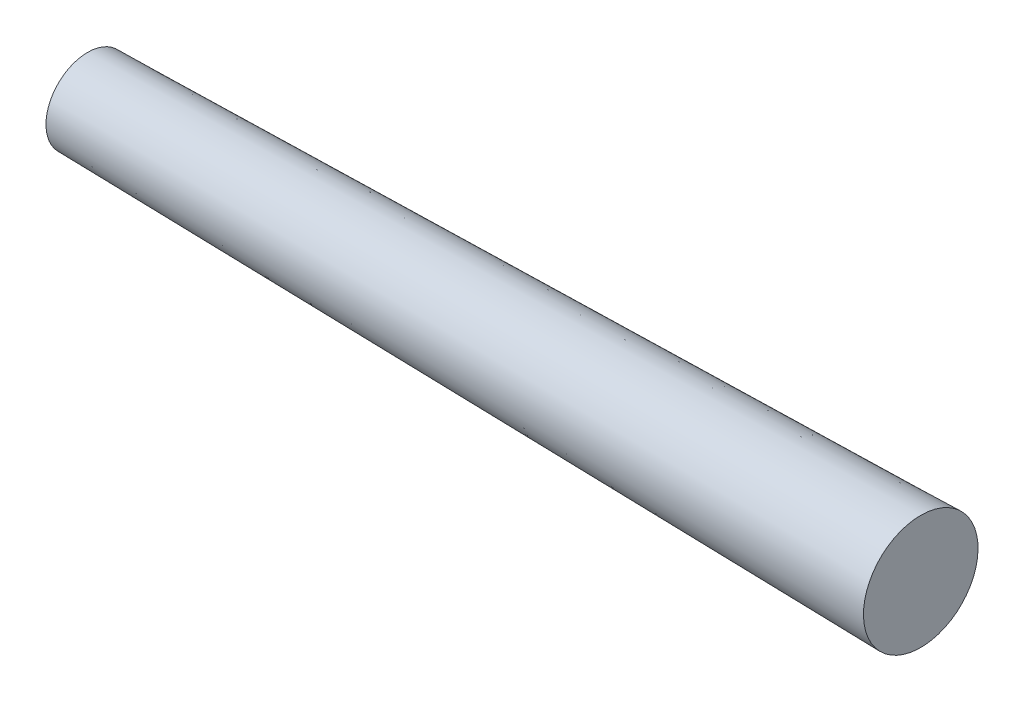
ISO-10303-21;
HEADER;
FILE_DESCRIPTION(('STEP AP214'),'2;1');
FILE_NAME('part.step','',(''),(''),'','','');
FILE_SCHEMA(('AUTOMOTIVE_DESIGN { 1 0 10303 214 1 1 1 1 }'));
ENDSEC;
DATA;
#1=APPLICATION_CONTEXT('core data for automotive mechanical design processes');
#2=APPLICATION_PROTOCOL_DEFINITION('international standard','automotive_design',2000,#1);
#3=PRODUCT_CONTEXT('',#1,'mechanical');
#4=PRODUCT('Part','Part','',(#3));
#5=PRODUCT_RELATED_PRODUCT_CATEGORY('part','',(#4));
#6=PRODUCT_DEFINITION_FORMATION('','',#4);
#7=PRODUCT_DEFINITION_CONTEXT('part definition',#1,'design');
#8=PRODUCT_DEFINITION('design','',#6,#7);
#9=PRODUCT_DEFINITION_SHAPE('','',#8);
#10=(LENGTH_UNIT() NAMED_UNIT(*) SI_UNIT(.MILLI.,.METRE.));
#11=(NAMED_UNIT(*) PLANE_ANGLE_UNIT() SI_UNIT($,.RADIAN.));
#12=(NAMED_UNIT(*) SI_UNIT($,.STERADIAN.) SOLID_ANGLE_UNIT());
#13=UNCERTAINTY_MEASURE_WITH_UNIT(LENGTH_MEASURE(1.E-05),#10,'distance_accuracy_value','');
#14=(GEOMETRIC_REPRESENTATION_CONTEXT(3) GLOBAL_UNCERTAINTY_ASSIGNED_CONTEXT((#13)) GLOBAL_UNIT_ASSIGNED_CONTEXT((#10,
#11,#12)) REPRESENTATION_CONTEXT('',''));
#15=CARTESIAN_POINT('',(0.,0.,0.));
#16=DIRECTION('',(0.,0.,1.));
#17=DIRECTION('',(1.,0.,0.));
#18=AXIS2_PLACEMENT_3D('',#15,#16,#17);
#19=CARTESIAN_POINT('',(-33.8804000981836,2.5,0.));
#20=DIRECTION('',(-1.,0.,0.));
#21=DIRECTION('',(0.,-1.,0.));
#22=AXIS2_PLACEMENT_3D('',#19,#20,#21);
#23=PLANE('',#22);
#24=CARTESIAN_POINT('',(-33.8804000981836,0.,0.));
#25=DIRECTION('',(1.,0.,0.));
#26=DIRECTION('',(0.,1.,0.));
#27=AXIS2_PLACEMENT_3D('',#24,#25,#26);
#28=CIRCLE('',#27,4.);
#29=CARTESIAN_POINT('',(-33.8804000981836,4.,0.));
#30=VERTEX_POINT('',#29);
#31=EDGE_CURVE('E10',#30,#30,#28,.T.);
#32=ORIENTED_EDGE('',*,*,#31,.F.);
#33=EDGE_LOOP('',(#32));
#34=FACE_BOUND('',#33,.T.);
#35=ADVANCED_FACE('F31',(#34),#23,.T.);
#36=CARTESIAN_POINT('',(46.1195999018164,0.,0.));
#37=DIRECTION('',(1.,0.,0.));
#38=DIRECTION('',(0.,1.,0.));
#39=AXIS2_PLACEMENT_3D('',#36,#37,#38);
#40=CONICAL_SURFACE('',#39,5.5,0.0187478031977444);
#41=ORIENTED_EDGE('',*,*,#31,.T.);
#42=EDGE_LOOP('',(#41));
#43=FACE_BOUND('',#42,.T.);
#44=CARTESIAN_POINT('',(46.1195999018164,0.,0.));
#45=DIRECTION('',(1.,0.,0.));
#46=DIRECTION('',(0.,1.,0.));
#47=AXIS2_PLACEMENT_3D('',#44,#45,#46);
#48=CIRCLE('',#47,5.5);
#49=CARTESIAN_POINT('',(46.1195999018164,5.50000000000001,0.));
#50=VERTEX_POINT('',#49);
#51=EDGE_CURVE('E37',#50,#50,#48,.T.);
#52=ORIENTED_EDGE('',*,*,#51,.F.);
#53=EDGE_LOOP('',(#52));
#54=FACE_BOUND('',#53,.T.);
#55=ADVANCED_FACE('F45',(#43,#54),#40,.T.);
#56=CARTESIAN_POINT('',(46.1195999018164,5.50000000000001,0.));
#57=DIRECTION('',(1.,0.,0.));
#58=DIRECTION('',(0.,1.,0.));
#59=AXIS2_PLACEMENT_3D('',#56,#57,#58);
#60=PLANE('',#59);
#61=ORIENTED_EDGE('',*,*,#51,.T.);
#62=EDGE_LOOP('',(#61));
#63=FACE_BOUND('',#62,.T.);
#64=ADVANCED_FACE('F43',(#63),#60,.T.);
#65=CLOSED_SHELL('',(#35,#55,#64));
#66=MANIFOLD_SOLID_BREP('B2',#65);
#67=ADVANCED_BREP_SHAPE_REPRESENTATION('',(#18,#66),#14);
#68=SHAPE_DEFINITION_REPRESENTATION(#9,#67);
ENDSEC;
END-ISO-10303-21;
